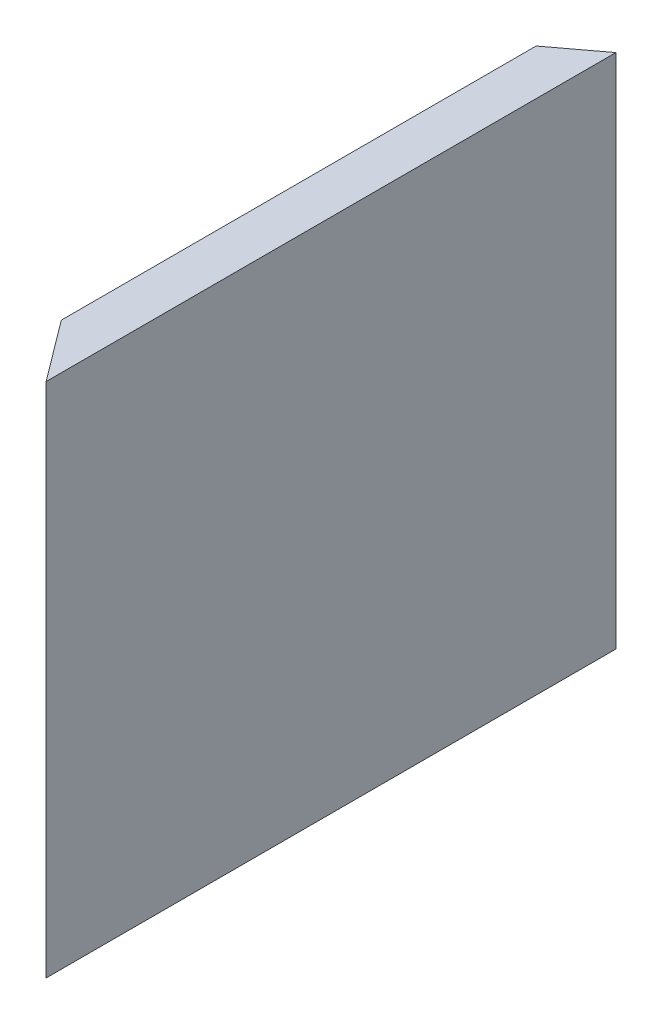
ISO-10303-21;
HEADER;
FILE_DESCRIPTION(('STEP AP214'),'2;1');
FILE_NAME('part.step','',(''),(''),'','','');
FILE_SCHEMA(('AUTOMOTIVE_DESIGN { 1 0 10303 214 1 1 1 1 }'));
ENDSEC;
DATA;
#1=APPLICATION_CONTEXT('core data for automotive mechanical design processes');
#2=APPLICATION_PROTOCOL_DEFINITION('international standard','automotive_design',2000,#1);
#3=PRODUCT_CONTEXT('',#1,'mechanical');
#4=PRODUCT('Part','Part','',(#3));
#5=PRODUCT_RELATED_PRODUCT_CATEGORY('part','',(#4));
#6=PRODUCT_DEFINITION_FORMATION('','',#4);
#7=PRODUCT_DEFINITION_CONTEXT('part definition',#1,'design');
#8=PRODUCT_DEFINITION('design','',#6,#7);
#9=PRODUCT_DEFINITION_SHAPE('','',#8);
#10=(LENGTH_UNIT() NAMED_UNIT(*) SI_UNIT(.MILLI.,.METRE.));
#11=(NAMED_UNIT(*) PLANE_ANGLE_UNIT() SI_UNIT($,.RADIAN.));
#12=(NAMED_UNIT(*) SI_UNIT($,.STERADIAN.) SOLID_ANGLE_UNIT());
#13=UNCERTAINTY_MEASURE_WITH_UNIT(LENGTH_MEASURE(1.E-05),#10,'distance_accuracy_value','');
#14=(GEOMETRIC_REPRESENTATION_CONTEXT(3) GLOBAL_UNCERTAINTY_ASSIGNED_CONTEXT((#13)) GLOBAL_UNIT_ASSIGNED_CONTEXT((#10,
#11,#12)) REPRESENTATION_CONTEXT('',''));
#15=CARTESIAN_POINT('',(0.,0.,0.));
#16=DIRECTION('',(0.,0.,1.));
#17=DIRECTION('',(1.,0.,0.));
#18=AXIS2_PLACEMENT_3D('',#15,#16,#17);
#19=CARTESIAN_POINT('',(6.,34.,37.5));
#20=DIRECTION('',(0.,-1.,0.));
#21=DIRECTION('',(0.,0.,-1.));
#22=AXIS2_PLACEMENT_3D('',#19,#20,#21);
#23=PLANE('',#22);
#24=DIRECTION('',(0.,0.,1.));
#25=VECTOR('',#24,1.);
#26=CARTESIAN_POINT('',(0.,34.,37.5));
#27=LINE('',#26,#25);
#28=CARTESIAN_POINT('',(0.,34.,-33.));
#29=VERTEX_POINT('',#28);
#30=CARTESIAN_POINT('',(0.,34.,29.5));
#31=VERTEX_POINT('',#30);
#32=EDGE_CURVE('E91',#29,#31,#27,.T.);
#33=ORIENTED_EDGE('',*,*,#32,.T.);
#34=DIRECTION('',(-0.6,0.,-0.8));
#35=VECTOR('',#34,1.);
#36=CARTESIAN_POINT('',(6.,34.,37.5));
#37=LINE('',#36,#35);
#38=CARTESIAN_POINT('',(6.,34.,37.5));
#39=VERTEX_POINT('',#38);
#40=EDGE_CURVE('E78',#39,#31,#37,.T.);
#41=ORIENTED_EDGE('',*,*,#40,.F.);
#42=DIRECTION('',(0.,0.,1.));
#43=VECTOR('',#42,1.);
#44=CARTESIAN_POINT('',(6.,34.,37.5));
#45=LINE('',#44,#43);
#46=CARTESIAN_POINT('',(6.,34.,-37.5));
#47=VERTEX_POINT('',#46);
#48=EDGE_CURVE('E93',#47,#39,#45,.T.);
#49=ORIENTED_EDGE('',*,*,#48,.F.);
#50=DIRECTION('',(-0.8,0.,0.6));
#51=VECTOR('',#50,1.);
#52=CARTESIAN_POINT('',(6.,34.,-37.5));
#53=LINE('',#52,#51);
#54=EDGE_CURVE('E82',#47,#29,#53,.T.);
#55=ORIENTED_EDGE('',*,*,#54,.T.);
#56=EDGE_LOOP('',(#33,#41,#49,#55));
#57=FACE_BOUND('',#56,.T.);
#58=ADVANCED_FACE('F35',(#57),#23,.F.);
#59=CARTESIAN_POINT('',(6.,-34.,37.5));
#60=DIRECTION('',(0.,1.,0.));
#61=DIRECTION('',(0.,0.,1.));
#62=AXIS2_PLACEMENT_3D('',#59,#60,#61);
#63=PLANE('',#62);
#64=DIRECTION('',(0.,0.,-1.));
#65=VECTOR('',#64,1.);
#66=CARTESIAN_POINT('',(6.,-34.,37.5));
#67=LINE('',#66,#65);
#68=CARTESIAN_POINT('',(6.,-34.,37.5));
#69=VERTEX_POINT('',#68);
#70=CARTESIAN_POINT('',(6.,-34.,-37.5));
#71=VERTEX_POINT('',#70);
#72=EDGE_CURVE('E11',#69,#71,#67,.T.);
#73=ORIENTED_EDGE('',*,*,#72,.F.);
#74=DIRECTION('',(-0.6,0.,-0.8));
#75=VECTOR('',#74,1.);
#76=CARTESIAN_POINT('',(6.,-34.,37.5));
#77=LINE('',#76,#75);
#78=CARTESIAN_POINT('',(0.,-34.,29.5));
#79=VERTEX_POINT('',#78);
#80=EDGE_CURVE('E57',#69,#79,#77,.T.);
#81=ORIENTED_EDGE('',*,*,#80,.T.);
#82=DIRECTION('',(0.,0.,-1.));
#83=VECTOR('',#82,1.);
#84=CARTESIAN_POINT('',(0.,-34.,37.5));
#85=LINE('',#84,#83);
#86=CARTESIAN_POINT('',(0.,-34.,-33.));
#87=VERTEX_POINT('',#86);
#88=EDGE_CURVE('E38',#79,#87,#85,.T.);
#89=ORIENTED_EDGE('',*,*,#88,.T.);
#90=DIRECTION('',(-0.8,0.,0.6));
#91=VECTOR('',#90,1.);
#92=CARTESIAN_POINT('',(6.,-34.,-37.5));
#93=LINE('',#92,#91);
#94=EDGE_CURVE('E97',#71,#87,#93,.T.);
#95=ORIENTED_EDGE('',*,*,#94,.F.);
#96=EDGE_LOOP('',(#73,#81,#89,#95));
#97=FACE_BOUND('',#96,.T.);
#98=ADVANCED_FACE('F85',(#97),#63,.F.);
#99=CARTESIAN_POINT('',(0.,0.,0.));
#100=DIRECTION('',(-1.,0.,0.));
#101=DIRECTION('',(0.,0.,1.));
#102=AXIS2_PLACEMENT_3D('',#99,#100,#101);
#103=PLANE('',#102);
#104=DIRECTION('',(0.,1.,0.));
#105=VECTOR('',#104,1.);
#106=CARTESIAN_POINT('',(0.,-34.,29.5));
#107=LINE('',#106,#105);
#108=EDGE_CURVE('E75',#79,#31,#107,.T.);
#109=ORIENTED_EDGE('',*,*,#108,.T.);
#110=ORIENTED_EDGE('',*,*,#32,.F.);
#111=DIRECTION('',(0.,1.,0.));
#112=VECTOR('',#111,1.);
#113=CARTESIAN_POINT('',(0.,-34.,-33.));
#114=LINE('',#113,#112);
#115=EDGE_CURVE('E89',#87,#29,#114,.T.);
#116=ORIENTED_EDGE('',*,*,#115,.F.);
#117=ORIENTED_EDGE('',*,*,#88,.F.);
#118=EDGE_LOOP('',(#109,#110,#116,#117));
#119=FACE_BOUND('',#118,.T.);
#120=ADVANCED_FACE('F88',(#119),#103,.T.);
#121=CARTESIAN_POINT('',(6.,0.,0.));
#122=DIRECTION('',(-1.,0.,0.));
#123=DIRECTION('',(0.,0.,1.));
#124=AXIS2_PLACEMENT_3D('',#121,#122,#123);
#125=PLANE('',#124);
#126=DIRECTION('',(0.,1.,0.));
#127=VECTOR('',#126,1.);
#128=CARTESIAN_POINT('',(6.,-34.,-37.5));
#129=LINE('',#128,#127);
#130=EDGE_CURVE('E90',#71,#47,#129,.T.);
#131=ORIENTED_EDGE('',*,*,#130,.T.);
#132=ORIENTED_EDGE('',*,*,#48,.T.);
#133=DIRECTION('',(0.,-1.,0.));
#134=VECTOR('',#133,1.);
#135=CARTESIAN_POINT('',(6.,-34.,37.5));
#136=LINE('',#135,#134);
#137=EDGE_CURVE('E43',#39,#69,#136,.T.);
#138=ORIENTED_EDGE('',*,*,#137,.T.);
#139=ORIENTED_EDGE('',*,*,#72,.T.);
#140=EDGE_LOOP('',(#131,#132,#138,#139));
#141=FACE_BOUND('',#140,.T.);
#142=ADVANCED_FACE('F108',(#141),#125,.F.);
#143=CARTESIAN_POINT('',(6.,-34.,-37.5));
#144=DIRECTION('',(-0.6,0.,-0.8));
#145=DIRECTION('',(-0.8,0.,0.6));
#146=AXIS2_PLACEMENT_3D('',#143,#144,#145);
#147=PLANE('',#146);
#148=ORIENTED_EDGE('',*,*,#54,.F.);
#149=ORIENTED_EDGE('',*,*,#130,.F.);
#150=ORIENTED_EDGE('',*,*,#94,.T.);
#151=ORIENTED_EDGE('',*,*,#115,.T.);
#152=EDGE_LOOP('',(#148,#149,#150,#151));
#153=FACE_BOUND('',#152,.T.);
#154=ADVANCED_FACE('F106',(#153),#147,.T.);
#155=CARTESIAN_POINT('',(6.,-34.,37.5));
#156=DIRECTION('',(0.8,0.,-0.6));
#157=DIRECTION('',(-0.6,0.,-0.8));
#158=AXIS2_PLACEMENT_3D('',#155,#156,#157);
#159=PLANE('',#158);
#160=ORIENTED_EDGE('',*,*,#40,.T.);
#161=ORIENTED_EDGE('',*,*,#108,.F.);
#162=ORIENTED_EDGE('',*,*,#80,.F.);
#163=ORIENTED_EDGE('',*,*,#137,.F.);
#164=EDGE_LOOP('',(#160,#161,#162,#163));
#165=FACE_BOUND('',#164,.T.);
#166=ADVANCED_FACE('F76',(#165),#159,.F.);
#167=CLOSED_SHELL('',(#58,#98,#120,#142,#154,#166));
#168=MANIFOLD_SOLID_BREP('B2',#167);
#169=ADVANCED_BREP_SHAPE_REPRESENTATION('',(#18,#168),#14);
#170=SHAPE_DEFINITION_REPRESENTATION(#9,#169);
ENDSEC;
END-ISO-10303-21;
